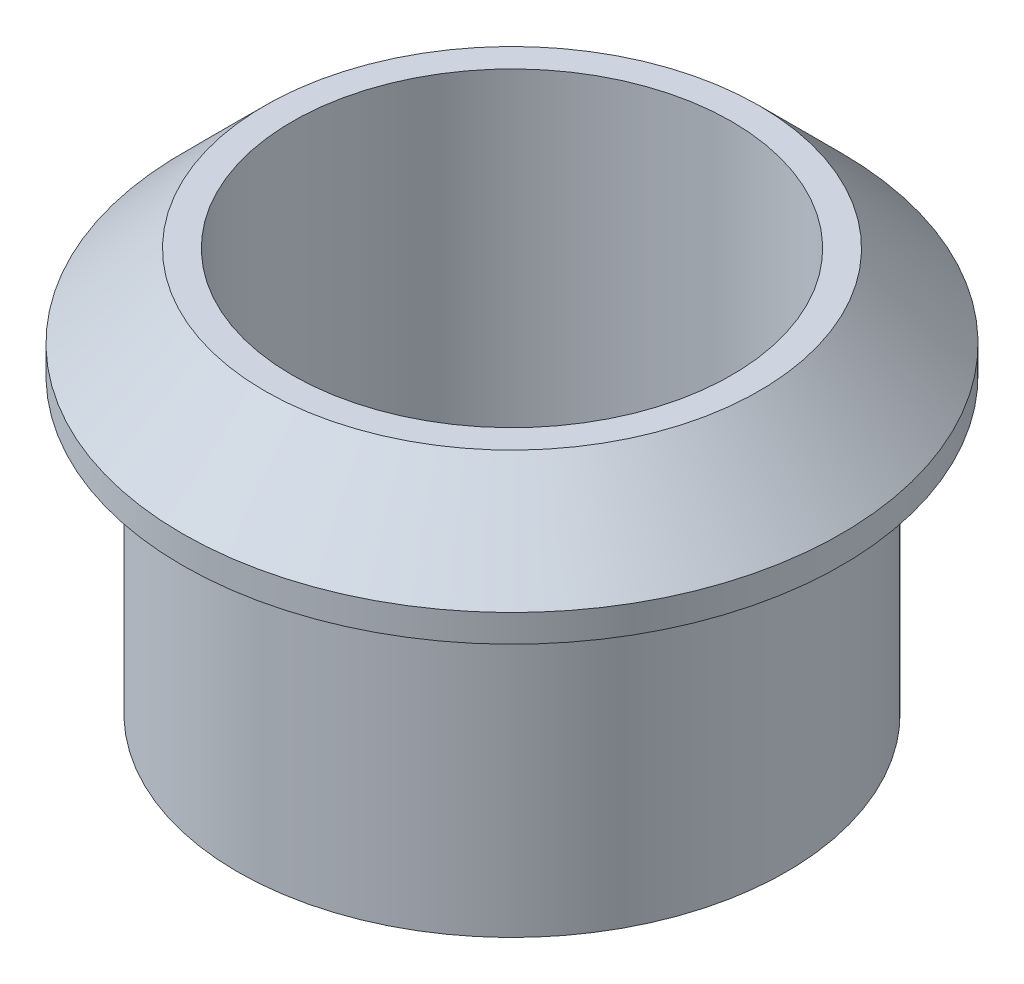
ISO-10303-21;
HEADER;
FILE_DESCRIPTION(('STEP AP214'),'2;1');
FILE_NAME('part.step','',(''),(''),'','','');
FILE_SCHEMA(('AUTOMOTIVE_DESIGN { 1 0 10303 214 1 1 1 1 }'));
ENDSEC;
DATA;
#1=APPLICATION_CONTEXT('core data for automotive mechanical design processes');
#2=APPLICATION_PROTOCOL_DEFINITION('international standard','automotive_design',2000,#1);
#3=PRODUCT_CONTEXT('',#1,'mechanical');
#4=PRODUCT('Part','Part','',(#3));
#5=PRODUCT_RELATED_PRODUCT_CATEGORY('part','',(#4));
#6=PRODUCT_DEFINITION_FORMATION('','',#4);
#7=PRODUCT_DEFINITION_CONTEXT('part definition',#1,'design');
#8=PRODUCT_DEFINITION('design','',#6,#7);
#9=PRODUCT_DEFINITION_SHAPE('','',#8);
#10=(LENGTH_UNIT() NAMED_UNIT(*) SI_UNIT(.MILLI.,.METRE.));
#11=(NAMED_UNIT(*) PLANE_ANGLE_UNIT() SI_UNIT($,.RADIAN.));
#12=(NAMED_UNIT(*) SI_UNIT($,.STERADIAN.) SOLID_ANGLE_UNIT());
#13=UNCERTAINTY_MEASURE_WITH_UNIT(LENGTH_MEASURE(1.E-05),#10,'distance_accuracy_value','');
#14=(GEOMETRIC_REPRESENTATION_CONTEXT(3) GLOBAL_UNCERTAINTY_ASSIGNED_CONTEXT((#13)) GLOBAL_UNIT_ASSIGNED_CONTEXT((#10,
#11,#12)) REPRESENTATION_CONTEXT('',''));
#15=CARTESIAN_POINT('',(0.,0.,0.));
#16=DIRECTION('',(0.,0.,1.));
#17=DIRECTION('',(1.,0.,0.));
#18=AXIS2_PLACEMENT_3D('',#15,#16,#17);
#19=CARTESIAN_POINT('',(7.495,0.,0.));
#20=DIRECTION('',(0.,-1.,0.));
#21=DIRECTION('',(0.,0.,-1.));
#22=AXIS2_PLACEMENT_3D('',#19,#20,#21);
#23=PLANE('',#22);
#24=CARTESIAN_POINT('',(0.,0.,0.));
#25=DIRECTION('',(0.,-1.,0.));
#26=DIRECTION('',(0.,0.,-1.));
#27=AXIS2_PLACEMENT_3D('',#24,#25,#26);
#28=CIRCLE('',#27,7.495);
#29=CARTESIAN_POINT('',(0.,0.,-7.495));
#30=VERTEX_POINT('',#29);
#31=EDGE_CURVE('E66',#30,#30,#28,.T.);
#32=ORIENTED_EDGE('',*,*,#31,.T.);
#33=EDGE_LOOP('',(#32));
#34=FACE_BOUND('',#33,.T.);
#35=CARTESIAN_POINT('',(0.,0.,0.));
#36=DIRECTION('',(0.,-1.,0.));
#37=DIRECTION('',(0.,0.,-1.));
#38=AXIS2_PLACEMENT_3D('',#35,#36,#37);
#39=CIRCLE('',#38,6.);
#40=CARTESIAN_POINT('',(0.,0.,-6.));
#41=VERTEX_POINT('',#40);
#42=EDGE_CURVE('E10',#41,#41,#39,.T.);
#43=ORIENTED_EDGE('',*,*,#42,.F.);
#44=EDGE_LOOP('',(#43));
#45=FACE_BOUND('',#44,.T.);
#46=ADVANCED_FACE('F41',(#34,#45),#23,.T.);
#47=CARTESIAN_POINT('',(0.,0.,0.));
#48=DIRECTION('',(0.,-1.,0.));
#49=DIRECTION('',(0.,0.,-1.));
#50=AXIS2_PLACEMENT_3D('',#47,#48,#49);
#51=CYLINDRICAL_SURFACE('',#50,6.);
#52=ORIENTED_EDGE('',*,*,#42,.T.);
#53=EDGE_LOOP('',(#52));
#54=FACE_BOUND('',#53,.T.);
#55=CARTESIAN_POINT('',(0.,11.,0.));
#56=DIRECTION('',(0.,-1.,0.));
#57=DIRECTION('',(0.,0.,-1.));
#58=AXIS2_PLACEMENT_3D('',#55,#56,#57);
#59=CIRCLE('',#58,6.);
#60=CARTESIAN_POINT('',(0.,11.,-6.));
#61=VERTEX_POINT('',#60);
#62=EDGE_CURVE('E47',#61,#61,#59,.T.);
#63=ORIENTED_EDGE('',*,*,#62,.F.);
#64=EDGE_LOOP('',(#63));
#65=FACE_BOUND('',#64,.T.);
#66=ADVANCED_FACE('F84',(#54,#65),#51,.F.);
#67=CARTESIAN_POINT('',(6.,11.,0.));
#68=DIRECTION('',(0.,1.,0.));
#69=DIRECTION('',(0.,0.,1.));
#70=AXIS2_PLACEMENT_3D('',#67,#68,#69);
#71=PLANE('',#70);
#72=ORIENTED_EDGE('',*,*,#62,.T.);
#73=EDGE_LOOP('',(#72));
#74=FACE_BOUND('',#73,.T.);
#75=CARTESIAN_POINT('',(0.,11.,0.));
#76=DIRECTION('',(0.,-1.,0.));
#77=DIRECTION('',(0.,0.,-1.));
#78=AXIS2_PLACEMENT_3D('',#75,#76,#77);
#79=CIRCLE('',#78,6.75);
#80=CARTESIAN_POINT('',(0.,11.,-6.75));
#81=VERTEX_POINT('',#80);
#82=EDGE_CURVE('E51',#81,#81,#79,.T.);
#83=ORIENTED_EDGE('',*,*,#82,.F.);
#84=EDGE_LOOP('',(#83));
#85=FACE_BOUND('',#84,.T.);
#86=ADVANCED_FACE('F88',(#74,#85),#71,.T.);
#87=CARTESIAN_POINT('',(0.,8.75000000000001,0.));
#88=DIRECTION('',(0.,-1.,0.));
#89=DIRECTION('',(0.,0.,-1.));
#90=AXIS2_PLACEMENT_3D('',#87,#88,#89);
#91=CONICAL_SURFACE('',#90,9.,0.78539816339745);
#92=ORIENTED_EDGE('',*,*,#82,.T.);
#93=EDGE_LOOP('',(#92));
#94=FACE_BOUND('',#93,.T.);
#95=CARTESIAN_POINT('',(0.,8.75000000000001,0.));
#96=DIRECTION('',(0.,-1.,0.));
#97=DIRECTION('',(0.,0.,-1.));
#98=AXIS2_PLACEMENT_3D('',#95,#96,#97);
#99=CIRCLE('',#98,9.);
#100=CARTESIAN_POINT('',(0.,8.75000000000001,-9.));
#101=VERTEX_POINT('',#100);
#102=EDGE_CURVE('E55',#101,#101,#99,.T.);
#103=ORIENTED_EDGE('',*,*,#102,.F.);
#104=EDGE_LOOP('',(#103));
#105=FACE_BOUND('',#104,.T.);
#106=ADVANCED_FACE('F92',(#94,#105),#91,.T.);
#107=CARTESIAN_POINT('',(0.,0.,0.));
#108=DIRECTION('',(0.,-1.,0.));
#109=DIRECTION('',(0.,0.,-1.));
#110=AXIS2_PLACEMENT_3D('',#107,#108,#109);
#111=CYLINDRICAL_SURFACE('',#110,9.);
#112=ORIENTED_EDGE('',*,*,#102,.T.);
#113=EDGE_LOOP('',(#112));
#114=FACE_BOUND('',#113,.T.);
#115=CARTESIAN_POINT('',(0.,8.,0.));
#116=DIRECTION('',(0.,-1.,0.));
#117=DIRECTION('',(0.,0.,-1.));
#118=AXIS2_PLACEMENT_3D('',#115,#116,#117);
#119=CIRCLE('',#118,9.);
#120=CARTESIAN_POINT('',(0.,8.,-9.));
#121=VERTEX_POINT('',#120);
#122=EDGE_CURVE('E60',#121,#121,#119,.T.);
#123=ORIENTED_EDGE('',*,*,#122,.F.);
#124=EDGE_LOOP('',(#123));
#125=FACE_BOUND('',#124,.T.);
#126=ADVANCED_FACE('F80',(#114,#125),#111,.T.);
#127=CARTESIAN_POINT('',(9.,8.,0.));
#128=DIRECTION('',(0.,-1.,0.));
#129=DIRECTION('',(0.,0.,-1.));
#130=AXIS2_PLACEMENT_3D('',#127,#128,#129);
#131=PLANE('',#130);
#132=ORIENTED_EDGE('',*,*,#122,.T.);
#133=EDGE_LOOP('',(#132));
#134=FACE_BOUND('',#133,.T.);
#135=CARTESIAN_POINT('',(0.,8.,0.));
#136=DIRECTION('',(0.,-1.,0.));
#137=DIRECTION('',(0.,0.,-1.));
#138=AXIS2_PLACEMENT_3D('',#135,#136,#137);
#139=CIRCLE('',#138,7.495);
#140=CARTESIAN_POINT('',(0.,8.,-7.495));
#141=VERTEX_POINT('',#140);
#142=EDGE_CURVE('E63',#141,#141,#139,.T.);
#143=ORIENTED_EDGE('',*,*,#142,.F.);
#144=EDGE_LOOP('',(#143));
#145=FACE_BOUND('',#144,.T.);
#146=ADVANCED_FACE('F74',(#134,#145),#131,.T.);
#147=CARTESIAN_POINT('',(0.,0.,0.));
#148=DIRECTION('',(0.,-1.,0.));
#149=DIRECTION('',(0.,0.,-1.));
#150=AXIS2_PLACEMENT_3D('',#147,#148,#149);
#151=CYLINDRICAL_SURFACE('',#150,7.495);
#152=ORIENTED_EDGE('',*,*,#142,.T.);
#153=EDGE_LOOP('',(#152));
#154=FACE_BOUND('',#153,.T.);
#155=ORIENTED_EDGE('',*,*,#31,.F.);
#156=EDGE_LOOP('',(#155));
#157=FACE_BOUND('',#156,.T.);
#158=ADVANCED_FACE('F72',(#154,#157),#151,.T.);
#159=CLOSED_SHELL('',(#46,#66,#86,#106,#126,#146,#158));
#160=MANIFOLD_SOLID_BREP('B2',#159);
#161=ADVANCED_BREP_SHAPE_REPRESENTATION('',(#18,#160),#14);
#162=SHAPE_DEFINITION_REPRESENTATION(#9,#161);
ENDSEC;
END-ISO-10303-21;
